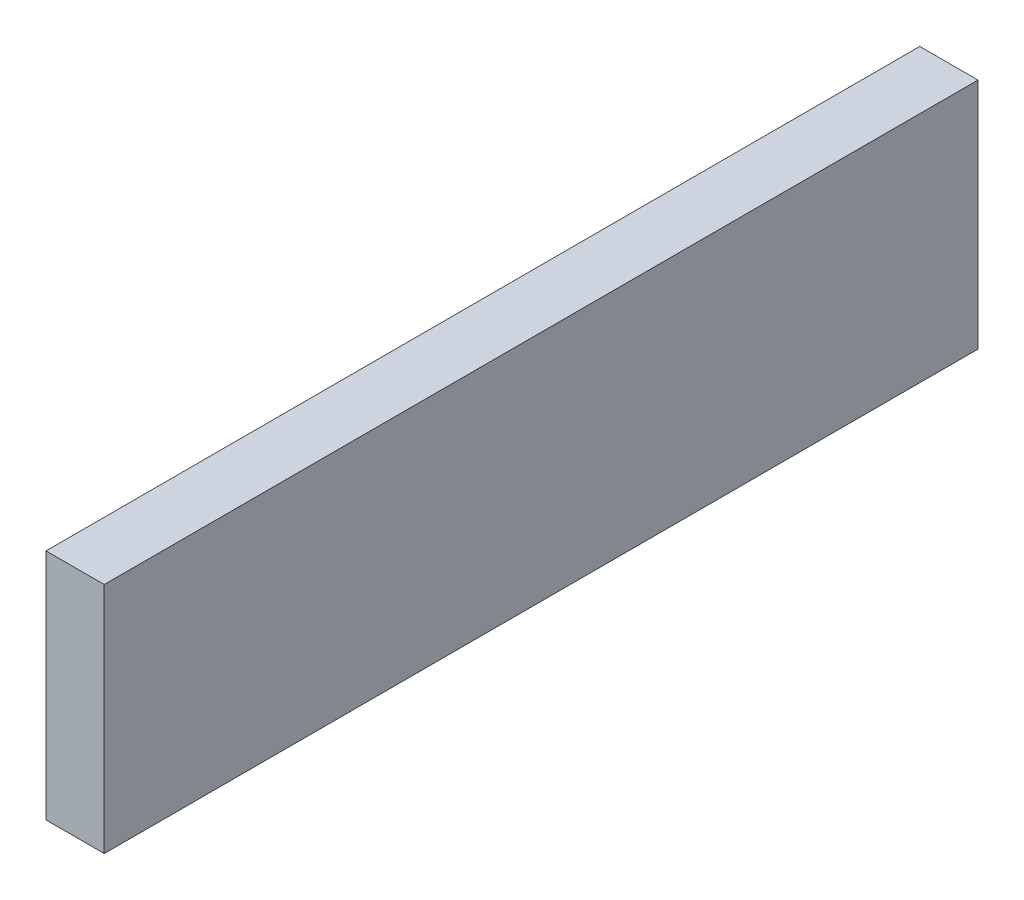
ISO-10303-21;
HEADER;
FILE_DESCRIPTION(('STEP AP214'),'2;1');
FILE_NAME('part.step','',(''),(''),'','','');
FILE_SCHEMA(('AUTOMOTIVE_DESIGN { 1 0 10303 214 1 1 1 1 }'));
ENDSEC;
DATA;
#1=APPLICATION_CONTEXT('core data for automotive mechanical design processes');
#2=APPLICATION_PROTOCOL_DEFINITION('international standard','automotive_design',2000,#1);
#3=PRODUCT_CONTEXT('',#1,'mechanical');
#4=PRODUCT('Part','Part','',(#3));
#5=PRODUCT_RELATED_PRODUCT_CATEGORY('part','',(#4));
#6=PRODUCT_DEFINITION_FORMATION('','',#4);
#7=PRODUCT_DEFINITION_CONTEXT('part definition',#1,'design');
#8=PRODUCT_DEFINITION('design','',#6,#7);
#9=PRODUCT_DEFINITION_SHAPE('','',#8);
#10=(LENGTH_UNIT() NAMED_UNIT(*) SI_UNIT(.MILLI.,.METRE.));
#11=(NAMED_UNIT(*) PLANE_ANGLE_UNIT() SI_UNIT($,.RADIAN.));
#12=(NAMED_UNIT(*) SI_UNIT($,.STERADIAN.) SOLID_ANGLE_UNIT());
#13=UNCERTAINTY_MEASURE_WITH_UNIT(LENGTH_MEASURE(1.E-05),#10,'distance_accuracy_value','');
#14=(GEOMETRIC_REPRESENTATION_CONTEXT(3) GLOBAL_UNCERTAINTY_ASSIGNED_CONTEXT((#13)) GLOBAL_UNIT_ASSIGNED_CONTEXT((#10,
#11,#12)) REPRESENTATION_CONTEXT('',''));
#15=CARTESIAN_POINT('',(0.,0.,0.));
#16=DIRECTION('',(0.,0.,1.));
#17=DIRECTION('',(1.,0.,0.));
#18=AXIS2_PLACEMENT_3D('',#15,#16,#17);
#19=CARTESIAN_POINT('',(6.35,0.,0.));
#20=DIRECTION('',(0.,0.,-1.));
#21=DIRECTION('',(0.,1.,0.));
#22=AXIS2_PLACEMENT_3D('',#19,#20,#21);
#23=PLANE('',#22);
#24=DIRECTION('',(0.,-1.,0.));
#25=VECTOR('',#24,1.);
#26=CARTESIAN_POINT('',(0.,0.,0.));
#27=LINE('',#26,#25);
#28=CARTESIAN_POINT('',(0.,0.,0.));
#29=VERTEX_POINT('',#28);
#30=CARTESIAN_POINT('',(0.,-25.4,0.));
#31=VERTEX_POINT('',#30);
#32=EDGE_CURVE('E107',#29,#31,#27,.T.);
#33=ORIENTED_EDGE('',*,*,#32,.T.);
#34=DIRECTION('',(-1.,0.,0.));
#35=VECTOR('',#34,1.);
#36=CARTESIAN_POINT('',(6.35,-25.4,0.));
#37=LINE('',#36,#35);
#38=CARTESIAN_POINT('',(6.35,-25.4,0.));
#39=VERTEX_POINT('',#38);
#40=EDGE_CURVE('E11',#39,#31,#37,.T.);
#41=ORIENTED_EDGE('',*,*,#40,.F.);
#42=DIRECTION('',(0.,-1.,0.));
#43=VECTOR('',#42,1.);
#44=CARTESIAN_POINT('',(6.35,0.,0.));
#45=LINE('',#44,#43);
#46=CARTESIAN_POINT('',(6.35,0.,0.));
#47=VERTEX_POINT('',#46);
#48=EDGE_CURVE('E91',#47,#39,#45,.T.);
#49=ORIENTED_EDGE('',*,*,#48,.F.);
#50=DIRECTION('',(-1.,0.,0.));
#51=VECTOR('',#50,1.);
#52=CARTESIAN_POINT('',(6.35,0.,0.));
#53=LINE('',#52,#51);
#54=EDGE_CURVE('E103',#47,#29,#53,.T.);
#55=ORIENTED_EDGE('',*,*,#54,.T.);
#56=EDGE_LOOP('',(#33,#41,#49,#55));
#57=FACE_BOUND('',#56,.T.);
#58=ADVANCED_FACE('F39',(#57),#23,.F.);
#59=CARTESIAN_POINT('',(6.35,-25.4,0.));
#60=DIRECTION('',(0.,1.,0.));
#61=DIRECTION('',(0.,0.,1.));
#62=AXIS2_PLACEMENT_3D('',#59,#60,#61);
#63=PLANE('',#62);
#64=DIRECTION('',(0.,0.,-1.));
#65=VECTOR('',#64,1.);
#66=CARTESIAN_POINT('',(0.,-25.4,0.));
#67=LINE('',#66,#65);
#68=CARTESIAN_POINT('',(0.,-25.4,-95.25));
#69=VERTEX_POINT('',#68);
#70=EDGE_CURVE('E96',#31,#69,#67,.T.);
#71=ORIENTED_EDGE('',*,*,#70,.T.);
#72=DIRECTION('',(-1.,0.,0.));
#73=VECTOR('',#72,1.);
#74=CARTESIAN_POINT('',(6.35,-25.4,-95.25));
#75=LINE('',#74,#73);
#76=CARTESIAN_POINT('',(6.35,-25.4,-95.25));
#77=VERTEX_POINT('',#76);
#78=EDGE_CURVE('E48',#77,#69,#75,.T.);
#79=ORIENTED_EDGE('',*,*,#78,.F.);
#80=DIRECTION('',(0.,0.,-1.));
#81=VECTOR('',#80,1.);
#82=CARTESIAN_POINT('',(6.35,-25.4,0.));
#83=LINE('',#82,#81);
#84=EDGE_CURVE('E86',#39,#77,#83,.T.);
#85=ORIENTED_EDGE('',*,*,#84,.F.);
#86=ORIENTED_EDGE('',*,*,#40,.T.);
#87=EDGE_LOOP('',(#71,#79,#85,#86));
#88=FACE_BOUND('',#87,.T.);
#89=ADVANCED_FACE('F95',(#88),#63,.F.);
#90=CARTESIAN_POINT('',(6.35,0.,-95.25));
#91=DIRECTION('',(0.,0.,1.));
#92=DIRECTION('',(1.,0.,0.));
#93=AXIS2_PLACEMENT_3D('',#90,#91,#92);
#94=PLANE('',#93);
#95=DIRECTION('',(0.,1.,0.));
#96=VECTOR('',#95,1.);
#97=CARTESIAN_POINT('',(0.,0.,-95.25));
#98=LINE('',#97,#96);
#99=CARTESIAN_POINT('',(0.,0.,-95.25));
#100=VERTEX_POINT('',#99);
#101=EDGE_CURVE('E73',#69,#100,#98,.T.);
#102=ORIENTED_EDGE('',*,*,#101,.T.);
#103=DIRECTION('',(-1.,0.,0.));
#104=VECTOR('',#103,1.);
#105=CARTESIAN_POINT('',(6.35,0.,-95.25));
#106=LINE('',#105,#104);
#107=CARTESIAN_POINT('',(6.35,0.,-95.25));
#108=VERTEX_POINT('',#107);
#109=EDGE_CURVE('E98',#108,#100,#106,.T.);
#110=ORIENTED_EDGE('',*,*,#109,.F.);
#111=DIRECTION('',(0.,1.,0.));
#112=VECTOR('',#111,1.);
#113=CARTESIAN_POINT('',(6.35,0.,-95.25));
#114=LINE('',#113,#112);
#115=EDGE_CURVE('E89',#77,#108,#114,.T.);
#116=ORIENTED_EDGE('',*,*,#115,.F.);
#117=ORIENTED_EDGE('',*,*,#78,.T.);
#118=EDGE_LOOP('',(#102,#110,#116,#117));
#119=FACE_BOUND('',#118,.T.);
#120=ADVANCED_FACE('F99',(#119),#94,.F.);
#121=CARTESIAN_POINT('',(6.35,0.,0.));
#122=DIRECTION('',(0.,-1.,0.));
#123=DIRECTION('',(0.,0.,-1.));
#124=AXIS2_PLACEMENT_3D('',#121,#122,#123);
#125=PLANE('',#124);
#126=DIRECTION('',(0.,0.,1.));
#127=VECTOR('',#126,1.);
#128=CARTESIAN_POINT('',(0.,0.,0.));
#129=LINE('',#128,#127);
#130=EDGE_CURVE('E79',#100,#29,#129,.T.);
#131=ORIENTED_EDGE('',*,*,#130,.T.);
#132=ORIENTED_EDGE('',*,*,#54,.F.);
#133=DIRECTION('',(0.,0.,1.));
#134=VECTOR('',#133,1.);
#135=CARTESIAN_POINT('',(6.35,0.,0.));
#136=LINE('',#135,#134);
#137=EDGE_CURVE('E56',#108,#47,#136,.T.);
#138=ORIENTED_EDGE('',*,*,#137,.F.);
#139=ORIENTED_EDGE('',*,*,#109,.T.);
#140=EDGE_LOOP('',(#131,#132,#138,#139));
#141=FACE_BOUND('',#140,.T.);
#142=ADVANCED_FACE('F120',(#141),#125,.F.);
#143=CARTESIAN_POINT('',(6.35,0.,0.));
#144=DIRECTION('',(1.,0.,0.));
#145=DIRECTION('',(0.,0.,-1.));
#146=AXIS2_PLACEMENT_3D('',#143,#144,#145);
#147=PLANE('',#146);
#148=ORIENTED_EDGE('',*,*,#48,.T.);
#149=ORIENTED_EDGE('',*,*,#84,.T.);
#150=ORIENTED_EDGE('',*,*,#115,.T.);
#151=ORIENTED_EDGE('',*,*,#137,.T.);
#152=EDGE_LOOP('',(#148,#149,#150,#151));
#153=FACE_BOUND('',#152,.T.);
#154=ADVANCED_FACE('F87',(#153),#147,.T.);
#155=CARTESIAN_POINT('',(0.,0.,0.));
#156=DIRECTION('',(1.,0.,0.));
#157=DIRECTION('',(0.,0.,-1.));
#158=AXIS2_PLACEMENT_3D('',#155,#156,#157);
#159=PLANE('',#158);
#160=ORIENTED_EDGE('',*,*,#32,.F.);
#161=ORIENTED_EDGE('',*,*,#130,.F.);
#162=ORIENTED_EDGE('',*,*,#101,.F.);
#163=ORIENTED_EDGE('',*,*,#70,.F.);
#164=EDGE_LOOP('',(#160,#161,#162,#163));
#165=FACE_BOUND('',#164,.T.);
#166=ADVANCED_FACE('F123',(#165),#159,.F.);
#167=CLOSED_SHELL('',(#58,#89,#120,#142,#154,#166));
#168=MANIFOLD_SOLID_BREP('B2',#167);
#169=ADVANCED_BREP_SHAPE_REPRESENTATION('',(#18,#168),#14);
#170=SHAPE_DEFINITION_REPRESENTATION(#9,#169);
ENDSEC;
END-ISO-10303-21;
